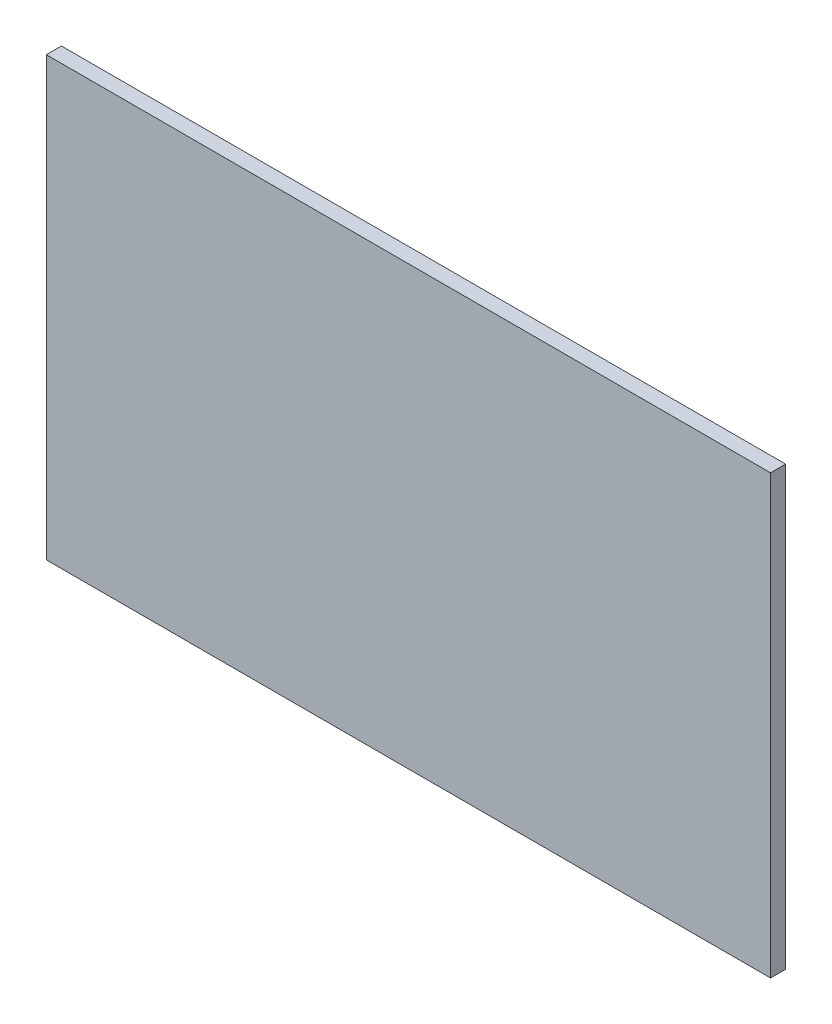
ISO-10303-21;
HEADER;
FILE_DESCRIPTION(('STEP AP214'),'2;1');
FILE_NAME('part.step','',(''),(''),'','','');
FILE_SCHEMA(('AUTOMOTIVE_DESIGN { 1 0 10303 214 1 1 1 1 }'));
ENDSEC;
DATA;
#1=APPLICATION_CONTEXT('core data for automotive mechanical design processes');
#2=APPLICATION_PROTOCOL_DEFINITION('international standard','automotive_design',2000,#1);
#3=PRODUCT_CONTEXT('',#1,'mechanical');
#4=PRODUCT('Part','Part','',(#3));
#5=PRODUCT_RELATED_PRODUCT_CATEGORY('part','',(#4));
#6=PRODUCT_DEFINITION_FORMATION('','',#4);
#7=PRODUCT_DEFINITION_CONTEXT('part definition',#1,'design');
#8=PRODUCT_DEFINITION('design','',#6,#7);
#9=PRODUCT_DEFINITION_SHAPE('','',#8);
#10=(LENGTH_UNIT() NAMED_UNIT(*) SI_UNIT(.MILLI.,.METRE.));
#11=(NAMED_UNIT(*) PLANE_ANGLE_UNIT() SI_UNIT($,.RADIAN.));
#12=(NAMED_UNIT(*) SI_UNIT($,.STERADIAN.) SOLID_ANGLE_UNIT());
#13=UNCERTAINTY_MEASURE_WITH_UNIT(LENGTH_MEASURE(1.E-05),#10,'distance_accuracy_value','');
#14=(GEOMETRIC_REPRESENTATION_CONTEXT(3) GLOBAL_UNCERTAINTY_ASSIGNED_CONTEXT((#13)) GLOBAL_UNIT_ASSIGNED_CONTEXT((#10,
#11,#12)) REPRESENTATION_CONTEXT('',''));
#15=CARTESIAN_POINT('',(0.,0.,0.));
#16=DIRECTION('',(0.,0.,1.));
#17=DIRECTION('',(1.,0.,0.));
#18=AXIS2_PLACEMENT_3D('',#15,#16,#17);
#19=CARTESIAN_POINT('',(0.,0.,5.));
#20=DIRECTION('',(1.,0.,0.));
#21=DIRECTION('',(0.,1.,0.));
#22=AXIS2_PLACEMENT_3D('',#19,#20,#21);
#23=PLANE('',#22);
#24=DIRECTION('',(0.,-1.,0.));
#25=VECTOR('',#24,1.);
#26=CARTESIAN_POINT('',(0.,0.,0.));
#27=LINE('',#26,#25);
#28=CARTESIAN_POINT('',(0.,0.,0.));
#29=VERTEX_POINT('',#28);
#30=CARTESIAN_POINT('',(0.,-145.,0.));
#31=VERTEX_POINT('',#30);
#32=EDGE_CURVE('E95',#29,#31,#27,.T.);
#33=ORIENTED_EDGE('',*,*,#32,.T.);
#34=DIRECTION('',(0.,0.,-1.));
#35=VECTOR('',#34,1.);
#36=CARTESIAN_POINT('',(0.,-145.,5.));
#37=LINE('',#36,#35);
#38=CARTESIAN_POINT('',(0.,-145.,5.));
#39=VERTEX_POINT('',#38);
#40=EDGE_CURVE('E11',#39,#31,#37,.T.);
#41=ORIENTED_EDGE('',*,*,#40,.F.);
#42=DIRECTION('',(0.,-1.,0.));
#43=VECTOR('',#42,1.);
#44=CARTESIAN_POINT('',(0.,0.,5.));
#45=LINE('',#44,#43);
#46=CARTESIAN_POINT('',(0.,0.,5.));
#47=VERTEX_POINT('',#46);
#48=EDGE_CURVE('E83',#47,#39,#45,.T.);
#49=ORIENTED_EDGE('',*,*,#48,.F.);
#50=DIRECTION('',(0.,0.,-1.));
#51=VECTOR('',#50,1.);
#52=CARTESIAN_POINT('',(0.,0.,5.));
#53=LINE('',#52,#51);
#54=EDGE_CURVE('E91',#47,#29,#53,.T.);
#55=ORIENTED_EDGE('',*,*,#54,.T.);
#56=EDGE_LOOP('',(#33,#41,#49,#55));
#57=FACE_BOUND('',#56,.T.);
#58=ADVANCED_FACE('F32',(#57),#23,.F.);
#59=CARTESIAN_POINT('',(0.,-145.,5.));
#60=DIRECTION('',(0.,1.,0.));
#61=DIRECTION('',(0.,0.,1.));
#62=AXIS2_PLACEMENT_3D('',#59,#60,#61);
#63=PLANE('',#62);
#64=DIRECTION('',(1.,0.,0.));
#65=VECTOR('',#64,1.);
#66=CARTESIAN_POINT('',(0.,-145.,0.));
#67=LINE('',#66,#65);
#68=CARTESIAN_POINT('',(240.,-145.,0.));
#69=VERTEX_POINT('',#68);
#70=EDGE_CURVE('E87',#31,#69,#67,.T.);
#71=ORIENTED_EDGE('',*,*,#70,.T.);
#72=DIRECTION('',(0.,0.,-1.));
#73=VECTOR('',#72,1.);
#74=CARTESIAN_POINT('',(240.,-145.,5.));
#75=LINE('',#74,#73);
#76=CARTESIAN_POINT('',(240.,-145.,5.));
#77=VERTEX_POINT('',#76);
#78=EDGE_CURVE('E40',#77,#69,#75,.T.);
#79=ORIENTED_EDGE('',*,*,#78,.F.);
#80=DIRECTION('',(1.,0.,0.));
#81=VECTOR('',#80,1.);
#82=CARTESIAN_POINT('',(0.,-145.,5.));
#83=LINE('',#82,#81);
#84=EDGE_CURVE('E78',#39,#77,#83,.T.);
#85=ORIENTED_EDGE('',*,*,#84,.F.);
#86=ORIENTED_EDGE('',*,*,#40,.T.);
#87=EDGE_LOOP('',(#71,#79,#85,#86));
#88=FACE_BOUND('',#87,.T.);
#89=ADVANCED_FACE('F86',(#88),#63,.F.);
#90=CARTESIAN_POINT('',(240.,0.,5.));
#91=DIRECTION('',(-1.,0.,0.));
#92=DIRECTION('',(0.,-1.,0.));
#93=AXIS2_PLACEMENT_3D('',#90,#91,#92);
#94=PLANE('',#93);
#95=DIRECTION('',(0.,1.,0.));
#96=VECTOR('',#95,1.);
#97=CARTESIAN_POINT('',(240.,0.,0.));
#98=LINE('',#97,#96);
#99=CARTESIAN_POINT('',(240.,0.,0.));
#100=VERTEX_POINT('',#99);
#101=EDGE_CURVE('E65',#69,#100,#98,.T.);
#102=ORIENTED_EDGE('',*,*,#101,.T.);
#103=DIRECTION('',(0.,0.,-1.));
#104=VECTOR('',#103,1.);
#105=CARTESIAN_POINT('',(240.,0.,5.));
#106=LINE('',#105,#104);
#107=CARTESIAN_POINT('',(240.,0.,5.));
#108=VERTEX_POINT('',#107);
#109=EDGE_CURVE('E88',#108,#100,#106,.T.);
#110=ORIENTED_EDGE('',*,*,#109,.F.);
#111=DIRECTION('',(0.,1.,0.));
#112=VECTOR('',#111,1.);
#113=CARTESIAN_POINT('',(240.,0.,5.));
#114=LINE('',#113,#112);
#115=EDGE_CURVE('E81',#77,#108,#114,.T.);
#116=ORIENTED_EDGE('',*,*,#115,.F.);
#117=ORIENTED_EDGE('',*,*,#78,.T.);
#118=EDGE_LOOP('',(#102,#110,#116,#117));
#119=FACE_BOUND('',#118,.T.);
#120=ADVANCED_FACE('F89',(#119),#94,.F.);
#121=CARTESIAN_POINT('',(0.,0.,5.));
#122=DIRECTION('',(0.,-1.,0.));
#123=DIRECTION('',(0.,0.,-1.));
#124=AXIS2_PLACEMENT_3D('',#121,#122,#123);
#125=PLANE('',#124);
#126=DIRECTION('',(-1.,0.,0.));
#127=VECTOR('',#126,1.);
#128=CARTESIAN_POINT('',(0.,0.,0.));
#129=LINE('',#128,#127);
#130=EDGE_CURVE('E71',#100,#29,#129,.T.);
#131=ORIENTED_EDGE('',*,*,#130,.T.);
#132=ORIENTED_EDGE('',*,*,#54,.F.);
#133=DIRECTION('',(-1.,0.,0.));
#134=VECTOR('',#133,1.);
#135=CARTESIAN_POINT('',(0.,0.,5.));
#136=LINE('',#135,#134);
#137=EDGE_CURVE('E48',#108,#47,#136,.T.);
#138=ORIENTED_EDGE('',*,*,#137,.F.);
#139=ORIENTED_EDGE('',*,*,#109,.T.);
#140=EDGE_LOOP('',(#131,#132,#138,#139));
#141=FACE_BOUND('',#140,.T.);
#142=ADVANCED_FACE('F102',(#141),#125,.F.);
#143=CARTESIAN_POINT('',(0.,0.,5.));
#144=DIRECTION('',(0.,0.,1.));
#145=DIRECTION('',(1.,0.,0.));
#146=AXIS2_PLACEMENT_3D('',#143,#144,#145);
#147=PLANE('',#146);
#148=ORIENTED_EDGE('',*,*,#48,.T.);
#149=ORIENTED_EDGE('',*,*,#84,.T.);
#150=ORIENTED_EDGE('',*,*,#115,.T.);
#151=ORIENTED_EDGE('',*,*,#137,.T.);
#152=EDGE_LOOP('',(#148,#149,#150,#151));
#153=FACE_BOUND('',#152,.T.);
#154=ADVANCED_FACE('F79',(#153),#147,.T.);
#155=CARTESIAN_POINT('',(0.,0.,0.));
#156=DIRECTION('',(0.,0.,1.));
#157=DIRECTION('',(1.,0.,0.));
#158=AXIS2_PLACEMENT_3D('',#155,#156,#157);
#159=PLANE('',#158);
#160=ORIENTED_EDGE('',*,*,#32,.F.);
#161=ORIENTED_EDGE('',*,*,#130,.F.);
#162=ORIENTED_EDGE('',*,*,#101,.F.);
#163=ORIENTED_EDGE('',*,*,#70,.F.);
#164=EDGE_LOOP('',(#160,#161,#162,#163));
#165=FACE_BOUND('',#164,.T.);
#166=ADVANCED_FACE('F105',(#165),#159,.F.);
#167=CLOSED_SHELL('',(#58,#89,#120,#142,#154,#166));
#168=MANIFOLD_SOLID_BREP('B2',#167);
#169=ADVANCED_BREP_SHAPE_REPRESENTATION('',(#18,#168),#14);
#170=SHAPE_DEFINITION_REPRESENTATION(#9,#169);
ENDSEC;
END-ISO-10303-21;
